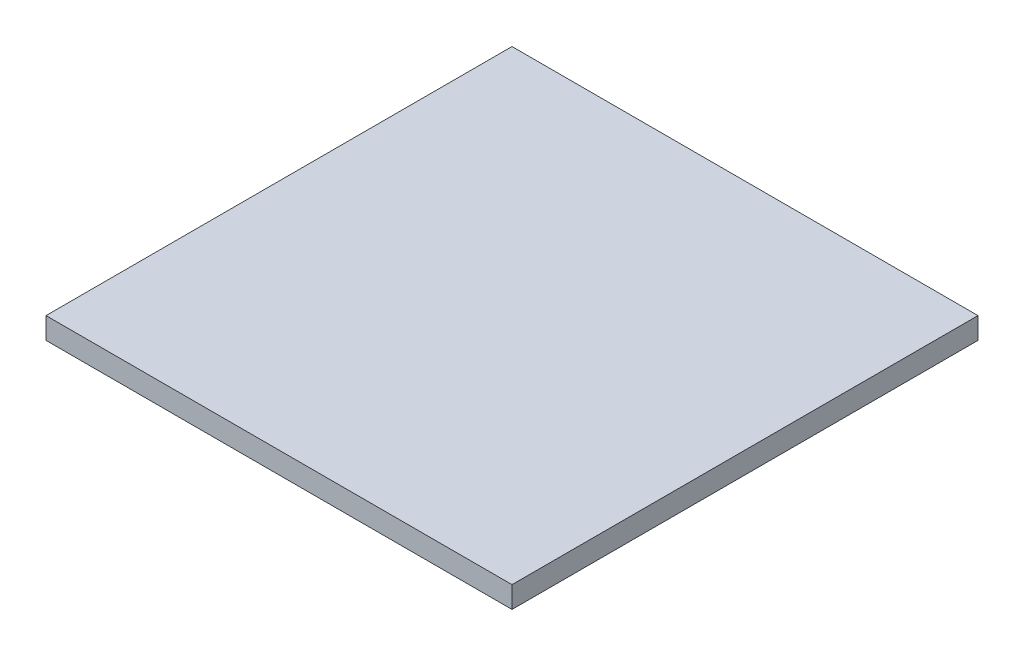
ISO-10303-21;
HEADER;
FILE_DESCRIPTION(('STEP AP214'),'2;1');
FILE_NAME('part.step','',(''),(''),'','','');
FILE_SCHEMA(('AUTOMOTIVE_DESIGN { 1 0 10303 214 1 1 1 1 }'));
ENDSEC;
DATA;
#1=APPLICATION_CONTEXT('core data for automotive mechanical design processes');
#2=APPLICATION_PROTOCOL_DEFINITION('international standard','automotive_design',2000,#1);
#3=PRODUCT_CONTEXT('',#1,'mechanical');
#4=PRODUCT('Part','Part','',(#3));
#5=PRODUCT_RELATED_PRODUCT_CATEGORY('part','',(#4));
#6=PRODUCT_DEFINITION_FORMATION('','',#4);
#7=PRODUCT_DEFINITION_CONTEXT('part definition',#1,'design');
#8=PRODUCT_DEFINITION('design','',#6,#7);
#9=PRODUCT_DEFINITION_SHAPE('','',#8);
#10=(LENGTH_UNIT() NAMED_UNIT(*) SI_UNIT(.MILLI.,.METRE.));
#11=(NAMED_UNIT(*) PLANE_ANGLE_UNIT() SI_UNIT($,.RADIAN.));
#12=(NAMED_UNIT(*) SI_UNIT($,.STERADIAN.) SOLID_ANGLE_UNIT());
#13=UNCERTAINTY_MEASURE_WITH_UNIT(LENGTH_MEASURE(1.E-05),#10,'distance_accuracy_value','');
#14=(GEOMETRIC_REPRESENTATION_CONTEXT(3) GLOBAL_UNCERTAINTY_ASSIGNED_CONTEXT((#13)) GLOBAL_UNIT_ASSIGNED_CONTEXT((#10,
#11,#12)) REPRESENTATION_CONTEXT('',''));
#15=CARTESIAN_POINT('',(0.,0.,0.));
#16=DIRECTION('',(0.,0.,1.));
#17=DIRECTION('',(1.,0.,0.));
#18=AXIS2_PLACEMENT_3D('',#15,#16,#17);
#19=CARTESIAN_POINT('',(65.,6.,-65.));
#20=DIRECTION('',(-1.,0.,0.));
#21=DIRECTION('',(0.,0.,1.));
#22=AXIS2_PLACEMENT_3D('',#19,#20,#21);
#23=PLANE('',#22);
#24=DIRECTION('',(0.,0.,-1.));
#25=VECTOR('',#24,1.);
#26=CARTESIAN_POINT('',(65.,0.,-65.));
#27=LINE('',#26,#25);
#28=CARTESIAN_POINT('',(65.,0.,65.));
#29=VERTEX_POINT('',#28);
#30=CARTESIAN_POINT('',(65.,0.,-65.));
#31=VERTEX_POINT('',#30);
#32=EDGE_CURVE('E107',#29,#31,#27,.T.);
#33=ORIENTED_EDGE('',*,*,#32,.T.);
#34=DIRECTION('',(0.,-1.,0.));
#35=VECTOR('',#34,1.);
#36=CARTESIAN_POINT('',(65.,6.,-65.));
#37=LINE('',#36,#35);
#38=CARTESIAN_POINT('',(65.,6.,-65.));
#39=VERTEX_POINT('',#38);
#40=EDGE_CURVE('E11',#39,#31,#37,.T.);
#41=ORIENTED_EDGE('',*,*,#40,.F.);
#42=DIRECTION('',(0.,0.,-1.));
#43=VECTOR('',#42,1.);
#44=CARTESIAN_POINT('',(65.,6.,-65.));
#45=LINE('',#44,#43);
#46=CARTESIAN_POINT('',(65.,6.,65.));
#47=VERTEX_POINT('',#46);
#48=EDGE_CURVE('E91',#47,#39,#45,.T.);
#49=ORIENTED_EDGE('',*,*,#48,.F.);
#50=DIRECTION('',(0.,-1.,0.));
#51=VECTOR('',#50,1.);
#52=CARTESIAN_POINT('',(65.,6.,65.));
#53=LINE('',#52,#51);
#54=EDGE_CURVE('E103',#47,#29,#53,.T.);
#55=ORIENTED_EDGE('',*,*,#54,.T.);
#56=EDGE_LOOP('',(#33,#41,#49,#55));
#57=FACE_BOUND('',#56,.T.);
#58=ADVANCED_FACE('F39',(#57),#23,.F.);
#59=CARTESIAN_POINT('',(-65.,6.,-65.));
#60=DIRECTION('',(0.,0.,1.));
#61=DIRECTION('',(1.,0.,0.));
#62=AXIS2_PLACEMENT_3D('',#59,#60,#61);
#63=PLANE('',#62);
#64=DIRECTION('',(-1.,0.,0.));
#65=VECTOR('',#64,1.);
#66=CARTESIAN_POINT('',(-65.,0.,-65.));
#67=LINE('',#66,#65);
#68=CARTESIAN_POINT('',(-65.,0.,-65.));
#69=VERTEX_POINT('',#68);
#70=EDGE_CURVE('E96',#31,#69,#67,.T.);
#71=ORIENTED_EDGE('',*,*,#70,.T.);
#72=DIRECTION('',(0.,-1.,0.));
#73=VECTOR('',#72,1.);
#74=CARTESIAN_POINT('',(-65.,6.,-65.));
#75=LINE('',#74,#73);
#76=CARTESIAN_POINT('',(-65.,6.,-65.));
#77=VERTEX_POINT('',#76);
#78=EDGE_CURVE('E48',#77,#69,#75,.T.);
#79=ORIENTED_EDGE('',*,*,#78,.F.);
#80=DIRECTION('',(-1.,0.,0.));
#81=VECTOR('',#80,1.);
#82=CARTESIAN_POINT('',(-65.,6.,-65.));
#83=LINE('',#82,#81);
#84=EDGE_CURVE('E86',#39,#77,#83,.T.);
#85=ORIENTED_EDGE('',*,*,#84,.F.);
#86=ORIENTED_EDGE('',*,*,#40,.T.);
#87=EDGE_LOOP('',(#71,#79,#85,#86));
#88=FACE_BOUND('',#87,.T.);
#89=ADVANCED_FACE('F95',(#88),#63,.F.);
#90=CARTESIAN_POINT('',(-65.,6.,-65.));
#91=DIRECTION('',(1.,0.,0.));
#92=DIRECTION('',(0.,0.,-1.));
#93=AXIS2_PLACEMENT_3D('',#90,#91,#92);
#94=PLANE('',#93);
#95=DIRECTION('',(0.,0.,1.));
#96=VECTOR('',#95,1.);
#97=CARTESIAN_POINT('',(-65.,0.,-65.));
#98=LINE('',#97,#96);
#99=CARTESIAN_POINT('',(-65.,0.,65.));
#100=VERTEX_POINT('',#99);
#101=EDGE_CURVE('E73',#69,#100,#98,.T.);
#102=ORIENTED_EDGE('',*,*,#101,.T.);
#103=DIRECTION('',(0.,-1.,0.));
#104=VECTOR('',#103,1.);
#105=CARTESIAN_POINT('',(-65.,6.,65.));
#106=LINE('',#105,#104);
#107=CARTESIAN_POINT('',(-65.,6.,65.));
#108=VERTEX_POINT('',#107);
#109=EDGE_CURVE('E98',#108,#100,#106,.T.);
#110=ORIENTED_EDGE('',*,*,#109,.F.);
#111=DIRECTION('',(0.,0.,1.));
#112=VECTOR('',#111,1.);
#113=CARTESIAN_POINT('',(-65.,6.,-65.));
#114=LINE('',#113,#112);
#115=EDGE_CURVE('E89',#77,#108,#114,.T.);
#116=ORIENTED_EDGE('',*,*,#115,.F.);
#117=ORIENTED_EDGE('',*,*,#78,.T.);
#118=EDGE_LOOP('',(#102,#110,#116,#117));
#119=FACE_BOUND('',#118,.T.);
#120=ADVANCED_FACE('F99',(#119),#94,.F.);
#121=CARTESIAN_POINT('',(-65.,6.,65.));
#122=DIRECTION('',(0.,0.,-1.));
#123=DIRECTION('',(-1.,0.,0.));
#124=AXIS2_PLACEMENT_3D('',#121,#122,#123);
#125=PLANE('',#124);
#126=DIRECTION('',(1.,0.,0.));
#127=VECTOR('',#126,1.);
#128=CARTESIAN_POINT('',(-65.,0.,65.));
#129=LINE('',#128,#127);
#130=EDGE_CURVE('E79',#100,#29,#129,.T.);
#131=ORIENTED_EDGE('',*,*,#130,.T.);
#132=ORIENTED_EDGE('',*,*,#54,.F.);
#133=DIRECTION('',(1.,0.,0.));
#134=VECTOR('',#133,1.);
#135=CARTESIAN_POINT('',(-65.,6.,65.));
#136=LINE('',#135,#134);
#137=EDGE_CURVE('E56',#108,#47,#136,.T.);
#138=ORIENTED_EDGE('',*,*,#137,.F.);
#139=ORIENTED_EDGE('',*,*,#109,.T.);
#140=EDGE_LOOP('',(#131,#132,#138,#139));
#141=FACE_BOUND('',#140,.T.);
#142=ADVANCED_FACE('F120',(#141),#125,.F.);
#143=CARTESIAN_POINT('',(0.,6.,0.));
#144=DIRECTION('',(0.,1.,0.));
#145=DIRECTION('',(0.,0.,1.));
#146=AXIS2_PLACEMENT_3D('',#143,#144,#145);
#147=PLANE('',#146);
#148=ORIENTED_EDGE('',*,*,#48,.T.);
#149=ORIENTED_EDGE('',*,*,#84,.T.);
#150=ORIENTED_EDGE('',*,*,#115,.T.);
#151=ORIENTED_EDGE('',*,*,#137,.T.);
#152=EDGE_LOOP('',(#148,#149,#150,#151));
#153=FACE_BOUND('',#152,.T.);
#154=ADVANCED_FACE('F87',(#153),#147,.T.);
#155=CARTESIAN_POINT('',(0.,0.,0.));
#156=DIRECTION('',(0.,1.,0.));
#157=DIRECTION('',(0.,0.,1.));
#158=AXIS2_PLACEMENT_3D('',#155,#156,#157);
#159=PLANE('',#158);
#160=ORIENTED_EDGE('',*,*,#32,.F.);
#161=ORIENTED_EDGE('',*,*,#130,.F.);
#162=ORIENTED_EDGE('',*,*,#101,.F.);
#163=ORIENTED_EDGE('',*,*,#70,.F.);
#164=EDGE_LOOP('',(#160,#161,#162,#163));
#165=FACE_BOUND('',#164,.T.);
#166=ADVANCED_FACE('F123',(#165),#159,.F.);
#167=CLOSED_SHELL('',(#58,#89,#120,#142,#154,#166));
#168=MANIFOLD_SOLID_BREP('B2',#167);
#169=ADVANCED_BREP_SHAPE_REPRESENTATION('',(#18,#168),#14);
#170=SHAPE_DEFINITION_REPRESENTATION(#9,#169);
ENDSEC;
END-ISO-10303-21;
